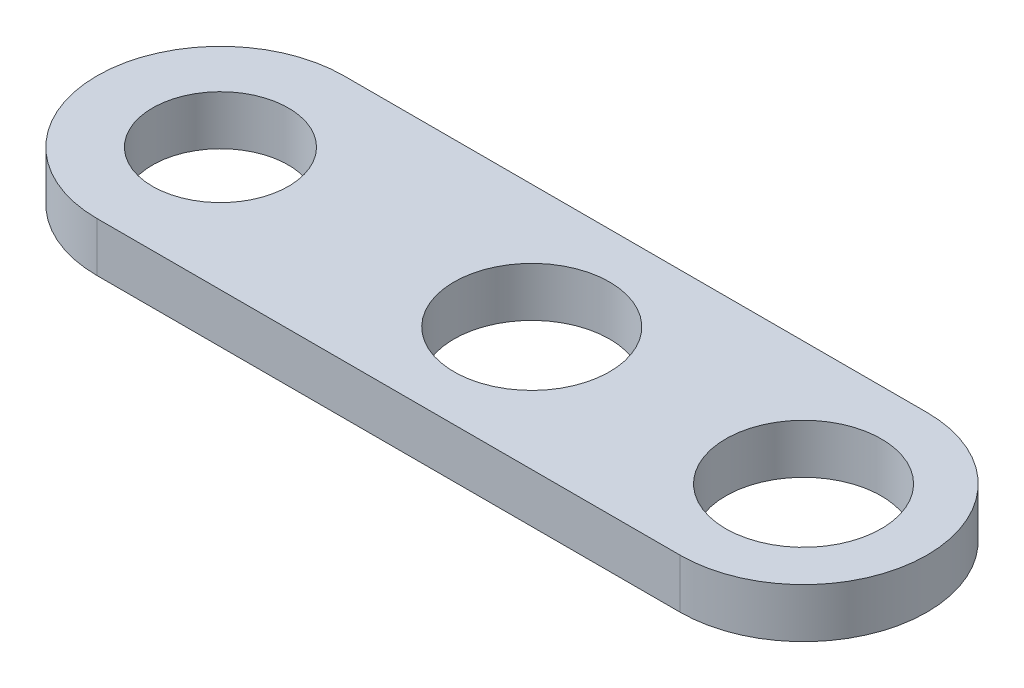
ISO-10303-21;
HEADER;
FILE_DESCRIPTION(('STEP AP214'),'2;1');
FILE_NAME('part.step','',(''),(''),'','','');
FILE_SCHEMA(('AUTOMOTIVE_DESIGN { 1 0 10303 214 1 1 1 1 }'));
ENDSEC;
DATA;
#1=APPLICATION_CONTEXT('core data for automotive mechanical design processes');
#2=APPLICATION_PROTOCOL_DEFINITION('international standard','automotive_design',2000,#1);
#3=PRODUCT_CONTEXT('',#1,'mechanical');
#4=PRODUCT('Part','Part','',(#3));
#5=PRODUCT_RELATED_PRODUCT_CATEGORY('part','',(#4));
#6=PRODUCT_DEFINITION_FORMATION('','',#4);
#7=PRODUCT_DEFINITION_CONTEXT('part definition',#1,'design');
#8=PRODUCT_DEFINITION('design','',#6,#7);
#9=PRODUCT_DEFINITION_SHAPE('','',#8);
#10=(LENGTH_UNIT() NAMED_UNIT(*) SI_UNIT(.MILLI.,.METRE.));
#11=(NAMED_UNIT(*) PLANE_ANGLE_UNIT() SI_UNIT($,.RADIAN.));
#12=(NAMED_UNIT(*) SI_UNIT($,.STERADIAN.) SOLID_ANGLE_UNIT());
#13=UNCERTAINTY_MEASURE_WITH_UNIT(LENGTH_MEASURE(1.E-05),#10,'distance_accuracy_value','');
#14=(GEOMETRIC_REPRESENTATION_CONTEXT(3) GLOBAL_UNCERTAINTY_ASSIGNED_CONTEXT((#13)) GLOBAL_UNIT_ASSIGNED_CONTEXT((#10,
#11,#12)) REPRESENTATION_CONTEXT('',''));
#15=CARTESIAN_POINT('',(0.,0.,0.));
#16=DIRECTION('',(0.,0.,1.));
#17=DIRECTION('',(1.,0.,0.));
#18=AXIS2_PLACEMENT_3D('',#15,#16,#17);
#19=CARTESIAN_POINT('',(0.,-2.,0.));
#20=DIRECTION('',(0.,1.,0.));
#21=DIRECTION('',(0.,0.,1.));
#22=AXIS2_PLACEMENT_3D('',#19,#20,#21);
#23=CYLINDRICAL_SURFACE('',#22,5.);
#24=CARTESIAN_POINT('',(0.,0.,0.));
#25=DIRECTION('',(0.,1.,0.));
#26=DIRECTION('',(0.,0.,1.));
#27=AXIS2_PLACEMENT_3D('',#24,#25,#26);
#28=CIRCLE('',#27,5.);
#29=CARTESIAN_POINT('',(0.,0.,-5.));
#30=VERTEX_POINT('',#29);
#31=CARTESIAN_POINT('',(0.,0.,5.));
#32=VERTEX_POINT('',#31);
#33=EDGE_CURVE('E100',#30,#32,#28,.T.);
#34=ORIENTED_EDGE('',*,*,#33,.F.);
#35=DIRECTION('',(0.,1.,0.));
#36=VECTOR('',#35,1.);
#37=CARTESIAN_POINT('',(0.,-2.,-5.));
#38=LINE('',#37,#36);
#39=CARTESIAN_POINT('',(0.,-2.,-5.));
#40=VERTEX_POINT('',#39);
#41=EDGE_CURVE('E11',#40,#30,#38,.T.);
#42=ORIENTED_EDGE('',*,*,#41,.F.);
#43=CARTESIAN_POINT('',(0.,-2.,0.));
#44=DIRECTION('',(0.,1.,0.));
#45=DIRECTION('',(0.,0.,1.));
#46=AXIS2_PLACEMENT_3D('',#43,#44,#45);
#47=CIRCLE('',#46,5.);
#48=CARTESIAN_POINT('',(0.,-2.,5.));
#49=VERTEX_POINT('',#48);
#50=EDGE_CURVE('E93',#40,#49,#47,.T.);
#51=ORIENTED_EDGE('',*,*,#50,.T.);
#52=DIRECTION('',(0.,1.,0.));
#53=VECTOR('',#52,1.);
#54=CARTESIAN_POINT('',(0.,-2.,5.));
#55=LINE('',#54,#53);
#56=EDGE_CURVE('E38',#49,#32,#55,.T.);
#57=ORIENTED_EDGE('',*,*,#56,.T.);
#58=EDGE_LOOP('',(#34,#42,#51,#57));
#59=FACE_BOUND('',#58,.T.);
#60=ADVANCED_FACE('F35',(#59),#23,.T.);
#61=CARTESIAN_POINT('',(23.6,-2.,-5.));
#62=DIRECTION('',(0.,0.,-1.));
#63=DIRECTION('',(-1.,0.,0.));
#64=AXIS2_PLACEMENT_3D('',#61,#62,#63);
#65=PLANE('',#64);
#66=DIRECTION('',(-1.,0.,0.));
#67=VECTOR('',#66,1.);
#68=CARTESIAN_POINT('',(23.6,0.,-5.));
#69=LINE('',#68,#67);
#70=CARTESIAN_POINT('',(23.6,0.,-5.));
#71=VERTEX_POINT('',#70);
#72=EDGE_CURVE('E95',#71,#30,#69,.T.);
#73=ORIENTED_EDGE('',*,*,#72,.F.);
#74=DIRECTION('',(0.,1.,0.));
#75=VECTOR('',#74,1.);
#76=CARTESIAN_POINT('',(23.6,-2.,-5.));
#77=LINE('',#76,#75);
#78=CARTESIAN_POINT('',(23.6,-2.,-5.));
#79=VERTEX_POINT('',#78);
#80=EDGE_CURVE('E44',#79,#71,#77,.T.);
#81=ORIENTED_EDGE('',*,*,#80,.F.);
#82=DIRECTION('',(-1.,0.,0.));
#83=VECTOR('',#82,1.);
#84=CARTESIAN_POINT('',(23.6,-2.,-5.));
#85=LINE('',#84,#83);
#86=EDGE_CURVE('E90',#79,#40,#85,.T.);
#87=ORIENTED_EDGE('',*,*,#86,.T.);
#88=ORIENTED_EDGE('',*,*,#41,.T.);
#89=EDGE_LOOP('',(#73,#81,#87,#88));
#90=FACE_BOUND('',#89,.T.);
#91=ADVANCED_FACE('F111',(#90),#65,.T.);
#92=CARTESIAN_POINT('',(23.6,-2.,0.));
#93=DIRECTION('',(0.,1.,0.));
#94=DIRECTION('',(0.,0.,1.));
#95=AXIS2_PLACEMENT_3D('',#92,#93,#94);
#96=CYLINDRICAL_SURFACE('',#95,5.);
#97=CARTESIAN_POINT('',(23.6,0.,0.));
#98=DIRECTION('',(0.,1.,0.));
#99=DIRECTION('',(0.,0.,1.));
#100=AXIS2_PLACEMENT_3D('',#97,#98,#99);
#101=CIRCLE('',#100,5.);
#102=CARTESIAN_POINT('',(23.6,0.,5.));
#103=VERTEX_POINT('',#102);
#104=EDGE_CURVE('E85',#103,#71,#101,.T.);
#105=ORIENTED_EDGE('',*,*,#104,.F.);
#106=DIRECTION('',(0.,1.,0.));
#107=VECTOR('',#106,1.);
#108=CARTESIAN_POINT('',(23.6,-2.,5.));
#109=LINE('',#108,#107);
#110=CARTESIAN_POINT('',(23.6,-2.,5.));
#111=VERTEX_POINT('',#110);
#112=EDGE_CURVE('E80',#111,#103,#109,.T.);
#113=ORIENTED_EDGE('',*,*,#112,.F.);
#114=CARTESIAN_POINT('',(23.6,-2.,0.));
#115=DIRECTION('',(0.,1.,0.));
#116=DIRECTION('',(0.,0.,1.));
#117=AXIS2_PLACEMENT_3D('',#114,#115,#116);
#118=CIRCLE('',#117,5.);
#119=EDGE_CURVE('E83',#111,#79,#118,.T.);
#120=ORIENTED_EDGE('',*,*,#119,.T.);
#121=ORIENTED_EDGE('',*,*,#80,.T.);
#122=EDGE_LOOP('',(#105,#113,#120,#121));
#123=FACE_BOUND('',#122,.T.);
#124=ADVANCED_FACE('F82',(#123),#96,.T.);
#125=CARTESIAN_POINT('',(0.,-2.,5.));
#126=DIRECTION('',(0.,0.,1.));
#127=DIRECTION('',(1.,0.,0.));
#128=AXIS2_PLACEMENT_3D('',#125,#126,#127);
#129=PLANE('',#128);
#130=DIRECTION('',(1.,0.,0.));
#131=VECTOR('',#130,1.);
#132=CARTESIAN_POINT('',(0.,0.,5.));
#133=LINE('',#132,#131);
#134=EDGE_CURVE('E103',#32,#103,#133,.T.);
#135=ORIENTED_EDGE('',*,*,#134,.F.);
#136=ORIENTED_EDGE('',*,*,#56,.F.);
#137=DIRECTION('',(1.,0.,0.));
#138=VECTOR('',#137,1.);
#139=CARTESIAN_POINT('',(0.,-2.,5.));
#140=LINE('',#139,#138);
#141=EDGE_CURVE('E89',#49,#111,#140,.T.);
#142=ORIENTED_EDGE('',*,*,#141,.T.);
#143=ORIENTED_EDGE('',*,*,#112,.T.);
#144=EDGE_LOOP('',(#135,#136,#142,#143));
#145=FACE_BOUND('',#144,.T.);
#146=ADVANCED_FACE('F92',(#145),#129,.T.);
#147=CARTESIAN_POINT('',(0.,-2.,0.));
#148=DIRECTION('',(0.,1.,0.));
#149=DIRECTION('',(0.,0.,1.));
#150=AXIS2_PLACEMENT_3D('',#147,#148,#149);
#151=PLANE('',#150);
#152=CARTESIAN_POINT('',(12.6,-2.,0.));
#153=DIRECTION('',(0.,1.,0.));
#154=DIRECTION('',(0.,0.,-1.));
#155=AXIS2_PLACEMENT_3D('',#152,#153,#154);
#156=CIRCLE('',#155,3.15);
#157=CARTESIAN_POINT('',(12.6,-2.,-3.15));
#158=VERTEX_POINT('',#157);
#159=EDGE_CURVE('E148',#158,#158,#156,.T.);
#160=ORIENTED_EDGE('',*,*,#159,.T.);
#161=EDGE_LOOP('',(#160));
#162=FACE_BOUND('',#161,.T.);
#163=CARTESIAN_POINT('',(23.6,-2.,0.));
#164=DIRECTION('',(0.,1.,0.));
#165=DIRECTION('',(0.,0.,1.));
#166=AXIS2_PLACEMENT_3D('',#163,#164,#165);
#167=CIRCLE('',#166,3.14999999999999);
#168=CARTESIAN_POINT('',(23.6,-2.,3.14999999999999));
#169=VERTEX_POINT('',#168);
#170=EDGE_CURVE('E156',#169,#169,#167,.T.);
#171=ORIENTED_EDGE('',*,*,#170,.T.);
#172=EDGE_LOOP('',(#171));
#173=FACE_BOUND('',#172,.T.);
#174=CARTESIAN_POINT('',(0.,-2.,0.));
#175=DIRECTION('',(0.,1.,0.));
#176=DIRECTION('',(0.,0.,1.));
#177=AXIS2_PLACEMENT_3D('',#174,#175,#176);
#178=CIRCLE('',#177,2.75);
#179=CARTESIAN_POINT('',(0.,-2.,2.75));
#180=VERTEX_POINT('',#179);
#181=EDGE_CURVE('E104',#180,#180,#178,.T.);
#182=ORIENTED_EDGE('',*,*,#181,.T.);
#183=EDGE_LOOP('',(#182));
#184=FACE_BOUND('',#183,.T.);
#185=ORIENTED_EDGE('',*,*,#50,.F.);
#186=ORIENTED_EDGE('',*,*,#86,.F.);
#187=ORIENTED_EDGE('',*,*,#119,.F.);
#188=ORIENTED_EDGE('',*,*,#141,.F.);
#189=EDGE_LOOP('',(#185,#186,#187,#188));
#190=FACE_BOUND('',#189,.T.);
#191=ADVANCED_FACE('F88',(#162,#173,#184,#190),#151,.F.);
#192=CARTESIAN_POINT('',(0.,0.,0.));
#193=DIRECTION('',(0.,1.,0.));
#194=DIRECTION('',(0.,0.,1.));
#195=AXIS2_PLACEMENT_3D('',#192,#193,#194);
#196=PLANE('',#195);
#197=CARTESIAN_POINT('',(12.6,0.,0.));
#198=DIRECTION('',(0.,1.,0.));
#199=DIRECTION('',(0.,0.,-1.));
#200=AXIS2_PLACEMENT_3D('',#197,#198,#199);
#201=CIRCLE('',#200,3.15);
#202=CARTESIAN_POINT('',(12.6,0.,-3.15));
#203=VERTEX_POINT('',#202);
#204=EDGE_CURVE('E151',#203,#203,#201,.T.);
#205=ORIENTED_EDGE('',*,*,#204,.F.);
#206=EDGE_LOOP('',(#205));
#207=FACE_BOUND('',#206,.T.);
#208=CARTESIAN_POINT('',(23.6,0.,0.));
#209=DIRECTION('',(0.,1.,0.));
#210=DIRECTION('',(0.,0.,1.));
#211=AXIS2_PLACEMENT_3D('',#208,#209,#210);
#212=CIRCLE('',#211,3.14999999999999);
#213=CARTESIAN_POINT('',(23.6,0.,3.14999999999999));
#214=VERTEX_POINT('',#213);
#215=EDGE_CURVE('E153',#214,#214,#212,.T.);
#216=ORIENTED_EDGE('',*,*,#215,.F.);
#217=EDGE_LOOP('',(#216));
#218=FACE_BOUND('',#217,.T.);
#219=CARTESIAN_POINT('',(0.,0.,0.));
#220=DIRECTION('',(0.,1.,0.));
#221=DIRECTION('',(0.,0.,1.));
#222=AXIS2_PLACEMENT_3D('',#219,#220,#221);
#223=CIRCLE('',#222,2.75);
#224=CARTESIAN_POINT('',(0.,0.,2.75));
#225=VERTEX_POINT('',#224);
#226=EDGE_CURVE('E159',#225,#225,#223,.T.);
#227=ORIENTED_EDGE('',*,*,#226,.F.);
#228=EDGE_LOOP('',(#227));
#229=FACE_BOUND('',#228,.T.);
#230=ORIENTED_EDGE('',*,*,#33,.T.);
#231=ORIENTED_EDGE('',*,*,#134,.T.);
#232=ORIENTED_EDGE('',*,*,#104,.T.);
#233=ORIENTED_EDGE('',*,*,#72,.T.);
#234=EDGE_LOOP('',(#230,#231,#232,#233));
#235=FACE_BOUND('',#234,.T.);
#236=ADVANCED_FACE('F110',(#207,#218,#229,#235),#196,.T.);
#237=CARTESIAN_POINT('',(0.,-2.,0.));
#238=DIRECTION('',(0.,1.,0.));
#239=DIRECTION('',(0.,0.,1.));
#240=AXIS2_PLACEMENT_3D('',#237,#238,#239);
#241=CYLINDRICAL_SURFACE('',#240,2.75);
#242=ORIENTED_EDGE('',*,*,#181,.F.);
#243=EDGE_LOOP('',(#242));
#244=FACE_BOUND('',#243,.T.);
#245=ORIENTED_EDGE('',*,*,#226,.T.);
#246=EDGE_LOOP('',(#245));
#247=FACE_BOUND('',#246,.T.);
#248=ADVANCED_FACE('F129',(#244,#247),#241,.F.);
#249=CARTESIAN_POINT('',(23.6,-2.,0.));
#250=DIRECTION('',(0.,1.,0.));
#251=DIRECTION('',(0.,0.,1.));
#252=AXIS2_PLACEMENT_3D('',#249,#250,#251);
#253=CYLINDRICAL_SURFACE('',#252,3.14999999999999);
#254=ORIENTED_EDGE('',*,*,#170,.F.);
#255=EDGE_LOOP('',(#254));
#256=FACE_BOUND('',#255,.T.);
#257=ORIENTED_EDGE('',*,*,#215,.T.);
#258=EDGE_LOOP('',(#257));
#259=FACE_BOUND('',#258,.T.);
#260=ADVANCED_FACE('F136',(#256,#259),#253,.F.);
#261=CARTESIAN_POINT('',(12.6,-2.,0.));
#262=DIRECTION('',(0.,1.,0.));
#263=DIRECTION('',(0.,0.,1.));
#264=AXIS2_PLACEMENT_3D('',#261,#262,#263);
#265=CYLINDRICAL_SURFACE('',#264,3.15);
#266=ORIENTED_EDGE('',*,*,#159,.F.);
#267=EDGE_LOOP('',(#266));
#268=FACE_BOUND('',#267,.T.);
#269=ORIENTED_EDGE('',*,*,#204,.T.);
#270=EDGE_LOOP('',(#269));
#271=FACE_BOUND('',#270,.T.);
#272=ADVANCED_FACE('F140',(#268,#271),#265,.F.);
#273=CLOSED_SHELL('',(#60,#91,#124,#146,#191,#236,#248,#260,#272));
#274=MANIFOLD_SOLID_BREP('B2',#273);
#275=ADVANCED_BREP_SHAPE_REPRESENTATION('',(#18,#274),#14);
#276=SHAPE_DEFINITION_REPRESENTATION(#9,#275);
ENDSEC;
END-ISO-10303-21;
